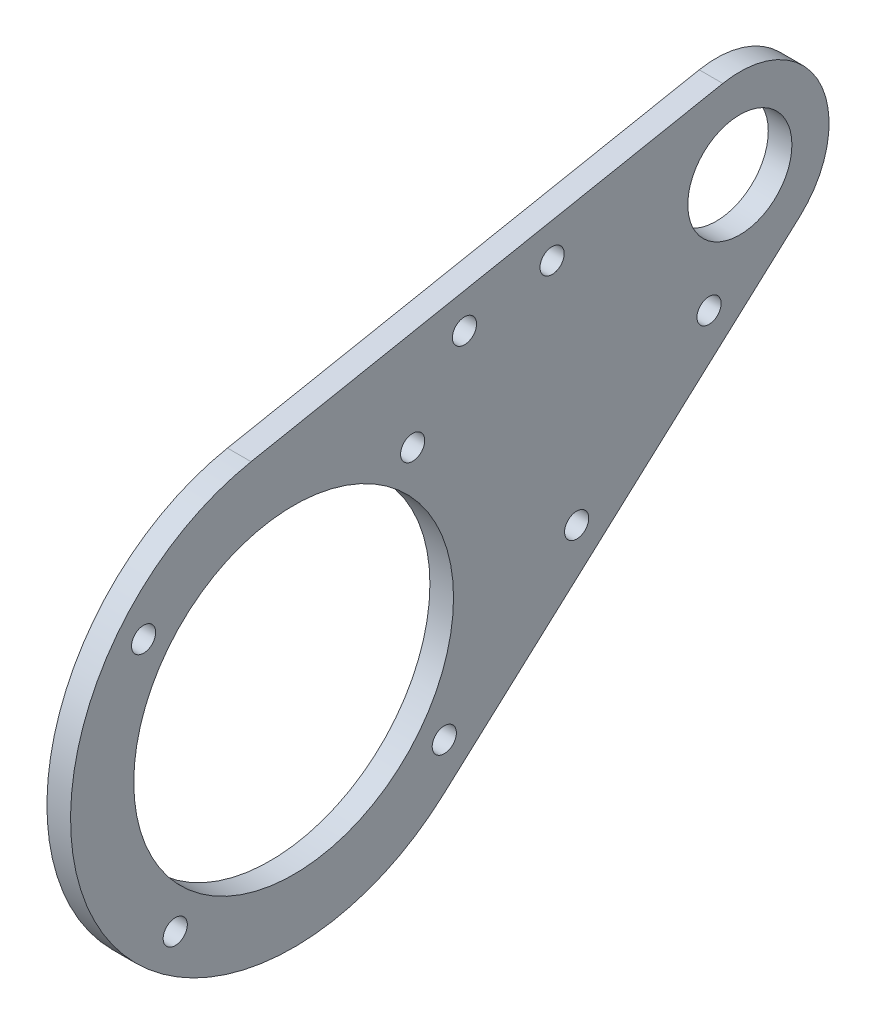
ISO-10303-21;
HEADER;
FILE_DESCRIPTION(('STEP AP214'),'2;1');
FILE_NAME('part.step','',(''),(''),'','','');
FILE_SCHEMA(('AUTOMOTIVE_DESIGN { 1 0 10303 214 1 1 1 1 }'));
ENDSEC;
DATA;
#1=APPLICATION_CONTEXT('core data for automotive mechanical design processes');
#2=APPLICATION_PROTOCOL_DEFINITION('international standard','automotive_design',2000,#1);
#3=PRODUCT_CONTEXT('',#1,'mechanical');
#4=PRODUCT('Part','Part','',(#3));
#5=PRODUCT_RELATED_PRODUCT_CATEGORY('part','',(#4));
#6=PRODUCT_DEFINITION_FORMATION('','',#4);
#7=PRODUCT_DEFINITION_CONTEXT('part definition',#1,'design');
#8=PRODUCT_DEFINITION('design','',#6,#7);
#9=PRODUCT_DEFINITION_SHAPE('','',#8);
#10=(LENGTH_UNIT() NAMED_UNIT(*) SI_UNIT(.MILLI.,.METRE.));
#11=(NAMED_UNIT(*) PLANE_ANGLE_UNIT() SI_UNIT($,.RADIAN.));
#12=(NAMED_UNIT(*) SI_UNIT($,.STERADIAN.) SOLID_ANGLE_UNIT());
#13=UNCERTAINTY_MEASURE_WITH_UNIT(LENGTH_MEASURE(1.E-05),#10,'distance_accuracy_value','');
#14=(GEOMETRIC_REPRESENTATION_CONTEXT(3) GLOBAL_UNCERTAINTY_ASSIGNED_CONTEXT((#13)) GLOBAL_UNIT_ASSIGNED_CONTEXT((#10,
#11,#12)) REPRESENTATION_CONTEXT('',''));
#15=CARTESIAN_POINT('',(0.,0.,0.));
#16=DIRECTION('',(0.,0.,1.));
#17=DIRECTION('',(1.,0.,0.));
#18=AXIS2_PLACEMENT_3D('',#15,#16,#17);
#19=CARTESIAN_POINT('',(3.175,0.,0.));
#20=DIRECTION('',(1.,0.,0.));
#21=DIRECTION('',(0.,0.,-1.));
#22=AXIS2_PLACEMENT_3D('',#19,#20,#21);
#23=PLANE('',#22);
#24=CARTESIAN_POINT('',(3.175,16.,20.1757899473602));
#25=DIRECTION('',(1.,0.,0.));
#26=DIRECTION('',(0.,0.,-1.));
#27=AXIS2_PLACEMENT_3D('',#24,#25,#26);
#28=CIRCLE('',#27,1.625);
#29=CARTESIAN_POINT('',(3.175,16.,18.5507899473602));
#30=VERTEX_POINT('',#29);
#31=EDGE_CURVE('E145',#30,#30,#28,.T.);
#32=ORIENTED_EDGE('',*,*,#31,.F.);
#33=EDGE_LOOP('',(#32));
#34=FACE_BOUND('',#33,.T.);
#35=CARTESIAN_POINT('',(3.175,30.3415774539269,-22.9747473053413));
#36=DIRECTION('',(1.,0.,0.));
#37=DIRECTION('',(0.,0.,1.));
#38=AXIS2_PLACEMENT_3D('',#35,#36,#37);
#39=CIRCLE('',#38,1.625);
#40=CARTESIAN_POINT('',(3.175,30.3415774539269,-21.3497473053413));
#41=VERTEX_POINT('',#40);
#42=EDGE_CURVE('E161',#41,#41,#39,.T.);
#43=ORIENTED_EDGE('',*,*,#42,.F.);
#44=EDGE_LOOP('',(#43));
#45=FACE_BOUND('',#44,.T.);
#46=CARTESIAN_POINT('',(3.175,32.631335668776,-34.7542637350396));
#47=DIRECTION('',(1.,0.,0.));
#48=DIRECTION('',(0.,0.,-1.));
#49=AXIS2_PLACEMENT_3D('',#46,#47,#48);
#50=CIRCLE('',#49,1.625);
#51=CARTESIAN_POINT('',(3.175,32.631335668776,-36.3792637350396));
#52=VERTEX_POINT('',#51);
#53=EDGE_CURVE('E167',#52,#52,#50,.T.);
#54=ORIENTED_EDGE('',*,*,#53,.F.);
#55=EDGE_LOOP('',(#54));
#56=FACE_BOUND('',#55,.T.);
#57=CARTESIAN_POINT('',(3.175,16.2743678016152,-55.8571432057428));
#58=DIRECTION('',(1.,0.,0.));
#59=DIRECTION('',(0.,0.,-1.));
#60=AXIS2_PLACEMENT_3D('',#57,#58,#59);
#61=CIRCLE('',#60,1.625);
#62=CARTESIAN_POINT('',(3.175,16.2743678016152,-57.4821432057428));
#63=VERTEX_POINT('',#62);
#64=EDGE_CURVE('E150',#63,#63,#61,.T.);
#65=ORIENTED_EDGE('',*,*,#64,.F.);
#66=EDGE_LOOP('',(#65));
#67=FACE_BOUND('',#66,.T.);
#68=CARTESIAN_POINT('',(3.175,20.2551011882643,-16.0039762986855));
#69=DIRECTION('',(1.,0.,0.));
#70=DIRECTION('',(0.,0.,-1.));
#71=AXIS2_PLACEMENT_3D('',#68,#69,#70);
#72=CIRCLE('',#71,1.625);
#73=CARTESIAN_POINT('',(3.175,20.2551011882643,-17.6289762986855));
#74=VERTEX_POINT('',#73);
#75=EDGE_CURVE('E142',#74,#74,#72,.T.);
#76=ORIENTED_EDGE('',*,*,#75,.F.);
#77=EDGE_LOOP('',(#76));
#78=FACE_BOUND('',#77,.T.);
#79=CARTESIAN_POINT('',(3.175,-15.9246650577813,-20.2590774869498));
#80=DIRECTION('',(1.,0.,0.));
#81=DIRECTION('',(0.,0.,-1.));
#82=AXIS2_PLACEMENT_3D('',#79,#80,#81);
#83=CIRCLE('',#82,1.62500000000001);
#84=CARTESIAN_POINT('',(3.175,-15.9246650577813,-21.8840774869498));
#85=VERTEX_POINT('',#84);
#86=EDGE_CURVE('E135',#85,#85,#83,.T.);
#87=ORIENTED_EDGE('',*,*,#86,.F.);
#88=EDGE_LOOP('',(#87));
#89=FACE_BOUND('',#88,.T.);
#90=CARTESIAN_POINT('',(3.175,-20.1797662460457,15.9206887590958));
#91=DIRECTION('',(1.,0.,0.));
#92=DIRECTION('',(0.,0.,-1.));
#93=AXIS2_PLACEMENT_3D('',#90,#91,#92);
#94=CIRCLE('',#93,1.625);
#95=CARTESIAN_POINT('',(3.175,-20.1797662460457,14.2956887590958));
#96=VERTEX_POINT('',#95);
#97=EDGE_CURVE('E136',#96,#96,#94,.T.);
#98=ORIENTED_EDGE('',*,*,#97,.F.);
#99=EDGE_LOOP('',(#98));
#100=FACE_BOUND('',#99,.T.);
#101=CARTESIAN_POINT('',(3.175,0.174851371916925,-38.0581103463463));
#102=DIRECTION('',(1.,0.,0.));
#103=DIRECTION('',(0.,0.,-1.));
#104=AXIS2_PLACEMENT_3D('',#101,#102,#103);
#105=CIRCLE('',#104,1.625);
#106=CARTESIAN_POINT('',(3.175,0.174851371916925,-39.6831103463463));
#107=VERTEX_POINT('',#106);
#108=EDGE_CURVE('E149',#107,#107,#105,.T.);
#109=ORIENTED_EDGE('',*,*,#108,.F.);
#110=EDGE_LOOP('',(#109));
#111=FACE_BOUND('',#110,.T.);
#112=CARTESIAN_POINT('',(3.175,0.,0.));
#113=DIRECTION('',(1.,0.,0.));
#114=DIRECTION('',(0.,0.,-1.));
#115=AXIS2_PLACEMENT_3D('',#112,#113,#114);
#116=CIRCLE('',#115,21.5);
#117=CARTESIAN_POINT('',(3.175,0.,-21.5));
#118=VERTEX_POINT('',#117);
#119=EDGE_CURVE('E108',#118,#118,#116,.T.);
#120=ORIENTED_EDGE('',*,*,#119,.F.);
#121=EDGE_LOOP('',(#120));
#122=FACE_BOUND('',#121,.T.);
#123=CARTESIAN_POINT('',(3.175,0.,0.));
#124=DIRECTION('',(1.,0.,0.));
#125=DIRECTION('',(0.,0.,-1.));
#126=AXIS2_PLACEMENT_3D('',#123,#124,#125);
#127=CIRCLE('',#126,30.);
#128=CARTESIAN_POINT('',(3.175,29.4487910742456,5.72439553712281));
#129=VERTEX_POINT('',#128);
#130=CARTESIAN_POINT('',(3.175,-22.2487910742456,-20.1243955371228));
#131=VERTEX_POINT('',#130);
#132=EDGE_CURVE('E93',#129,#131,#127,.T.);
#133=ORIENTED_EDGE('',*,*,#132,.T.);
#134=DIRECTION('',(0.,0.67081318457076,-0.741626369141521));
#135=VECTOR('',#134,1.);
#136=CARTESIAN_POINT('',(3.175,-22.2487910742456,-20.1243955371228));
#137=LINE('',#136,#135);
#138=CARTESIAN_POINT('',(3.175,21.1004835703017,-68.0497582148491));
#139=VERTEX_POINT('',#138);
#140=EDGE_CURVE('E88',#131,#139,#137,.T.);
#141=ORIENTED_EDGE('',*,*,#140,.T.);
#142=CARTESIAN_POINT('',(3.175,30.,-60.));
#143=DIRECTION('',(1.,0.,0.));
#144=DIRECTION('',(0.,0.,-1.));
#145=AXIS2_PLACEMENT_3D('',#142,#143,#144);
#146=CIRCLE('',#145,12.);
#147=CARTESIAN_POINT('',(3.175,41.7795164296983,-57.7102417851509));
#148=VERTEX_POINT('',#147);
#149=EDGE_CURVE('E91',#139,#148,#146,.T.);
#150=ORIENTED_EDGE('',*,*,#149,.T.);
#151=DIRECTION('',(0.,-0.190813184570761,0.981626369141521));
#152=VECTOR('',#151,1.);
#153=CARTESIAN_POINT('',(3.175,29.4487910742456,5.72439553712281));
#154=LINE('',#153,#152);
#155=EDGE_CURVE('E58',#148,#129,#154,.T.);
#156=ORIENTED_EDGE('',*,*,#155,.T.);
#157=EDGE_LOOP('',(#133,#141,#150,#156));
#158=FACE_BOUND('',#157,.T.);
#159=CARTESIAN_POINT('',(3.175,30.,-60.));
#160=DIRECTION('',(1.,0.,0.));
#161=DIRECTION('',(0.,0.,-1.));
#162=AXIS2_PLACEMENT_3D('',#159,#160,#161);
#163=CIRCLE('',#162,7.);
#164=CARTESIAN_POINT('',(3.175,30.,-67.));
#165=VERTEX_POINT('',#164);
#166=EDGE_CURVE('E123',#165,#165,#163,.T.);
#167=ORIENTED_EDGE('',*,*,#166,.F.);
#168=EDGE_LOOP('',(#167));
#169=FACE_BOUND('',#168,.T.);
#170=ADVANCED_FACE('F41',(#34,#45,#56,#67,#78,#89,#100,#111,#122,#158,#169),#23,.T.);
#171=CARTESIAN_POINT('',(0.,0.,0.));
#172=DIRECTION('',(1.,0.,0.));
#173=DIRECTION('',(0.,0.,-1.));
#174=AXIS2_PLACEMENT_3D('',#171,#172,#173);
#175=PLANE('',#174);
#176=CARTESIAN_POINT('',(0.,16.,20.1757899473602));
#177=DIRECTION('',(1.,0.,0.));
#178=DIRECTION('',(0.,0.,-1.));
#179=AXIS2_PLACEMENT_3D('',#176,#177,#178);
#180=CIRCLE('',#179,1.625);
#181=CARTESIAN_POINT('',(0.,16.,18.5507899473602));
#182=VERTEX_POINT('',#181);
#183=EDGE_CURVE('E129',#182,#182,#180,.T.);
#184=ORIENTED_EDGE('',*,*,#183,.T.);
#185=EDGE_LOOP('',(#184));
#186=FACE_BOUND('',#185,.T.);
#187=CARTESIAN_POINT('',(0.,30.3415774539269,-22.9747473053413));
#188=DIRECTION('',(1.,0.,0.));
#189=DIRECTION('',(0.,0.,1.));
#190=AXIS2_PLACEMENT_3D('',#187,#188,#189);
#191=CIRCLE('',#190,1.625);
#192=CARTESIAN_POINT('',(0.,30.3415774539269,-21.3497473053413));
#193=VERTEX_POINT('',#192);
#194=EDGE_CURVE('E158',#193,#193,#191,.T.);
#195=ORIENTED_EDGE('',*,*,#194,.T.);
#196=EDGE_LOOP('',(#195));
#197=FACE_BOUND('',#196,.T.);
#198=CARTESIAN_POINT('',(0.,32.631335668776,-34.7542637350396));
#199=DIRECTION('',(1.,0.,0.));
#200=DIRECTION('',(0.,0.,-1.));
#201=AXIS2_PLACEMENT_3D('',#198,#199,#200);
#202=CIRCLE('',#201,1.625);
#203=CARTESIAN_POINT('',(0.,32.631335668776,-36.3792637350396));
#204=VERTEX_POINT('',#203);
#205=EDGE_CURVE('E164',#204,#204,#202,.T.);
#206=ORIENTED_EDGE('',*,*,#205,.T.);
#207=EDGE_LOOP('',(#206));
#208=FACE_BOUND('',#207,.T.);
#209=CARTESIAN_POINT('',(0.,16.2743678016152,-55.8571432057428));
#210=DIRECTION('',(1.,0.,0.));
#211=DIRECTION('',(0.,0.,-1.));
#212=AXIS2_PLACEMENT_3D('',#209,#210,#211);
#213=CIRCLE('',#212,1.625);
#214=CARTESIAN_POINT('',(0.,16.2743678016152,-57.4821432057428));
#215=VERTEX_POINT('',#214);
#216=EDGE_CURVE('E170',#215,#215,#213,.T.);
#217=ORIENTED_EDGE('',*,*,#216,.T.);
#218=EDGE_LOOP('',(#217));
#219=FACE_BOUND('',#218,.T.);
#220=CARTESIAN_POINT('',(0.,20.2551011882643,-16.0039762986855));
#221=DIRECTION('',(1.,0.,0.));
#222=DIRECTION('',(0.,0.,-1.));
#223=AXIS2_PLACEMENT_3D('',#220,#221,#222);
#224=CIRCLE('',#223,1.625);
#225=CARTESIAN_POINT('',(0.,20.2551011882643,-17.6289762986855));
#226=VERTEX_POINT('',#225);
#227=EDGE_CURVE('E139',#226,#226,#224,.T.);
#228=ORIENTED_EDGE('',*,*,#227,.T.);
#229=EDGE_LOOP('',(#228));
#230=FACE_BOUND('',#229,.T.);
#231=CARTESIAN_POINT('',(0.,-15.9246650577813,-20.2590774869498));
#232=DIRECTION('',(1.,0.,0.));
#233=DIRECTION('',(0.,0.,-1.));
#234=AXIS2_PLACEMENT_3D('',#231,#232,#233);
#235=CIRCLE('',#234,1.62500000000001);
#236=CARTESIAN_POINT('',(0.,-15.9246650577813,-21.8840774869498));
#237=VERTEX_POINT('',#236);
#238=EDGE_CURVE('E132',#237,#237,#235,.T.);
#239=ORIENTED_EDGE('',*,*,#238,.T.);
#240=EDGE_LOOP('',(#239));
#241=FACE_BOUND('',#240,.T.);
#242=CARTESIAN_POINT('',(0.,-20.1797662460457,15.9206887590958));
#243=DIRECTION('',(1.,0.,0.));
#244=DIRECTION('',(0.,0.,-1.));
#245=AXIS2_PLACEMENT_3D('',#242,#243,#244);
#246=CIRCLE('',#245,1.625);
#247=CARTESIAN_POINT('',(0.,-20.1797662460457,14.2956887590958));
#248=VERTEX_POINT('',#247);
#249=EDGE_CURVE('E153',#248,#248,#246,.T.);
#250=ORIENTED_EDGE('',*,*,#249,.T.);
#251=EDGE_LOOP('',(#250));
#252=FACE_BOUND('',#251,.T.);
#253=CARTESIAN_POINT('',(0.,0.174851371916925,-38.0581103463463));
#254=DIRECTION('',(1.,0.,0.));
#255=DIRECTION('',(0.,0.,-1.));
#256=AXIS2_PLACEMENT_3D('',#253,#254,#255);
#257=CIRCLE('',#256,1.625);
#258=CARTESIAN_POINT('',(0.,0.174851371916925,-39.6831103463463));
#259=VERTEX_POINT('',#258);
#260=EDGE_CURVE('E146',#259,#259,#257,.T.);
#261=ORIENTED_EDGE('',*,*,#260,.T.);
#262=EDGE_LOOP('',(#261));
#263=FACE_BOUND('',#262,.T.);
#264=CARTESIAN_POINT('',(0.,0.,0.));
#265=DIRECTION('',(1.,0.,0.));
#266=DIRECTION('',(0.,0.,-1.));
#267=AXIS2_PLACEMENT_3D('',#264,#265,#266);
#268=CIRCLE('',#267,30.);
#269=CARTESIAN_POINT('',(0.,29.4487910742456,5.72439553712281));
#270=VERTEX_POINT('',#269);
#271=CARTESIAN_POINT('',(0.,-22.2487910742456,-20.1243955371228));
#272=VERTEX_POINT('',#271);
#273=EDGE_CURVE('E105',#270,#272,#268,.T.);
#274=ORIENTED_EDGE('',*,*,#273,.F.);
#275=DIRECTION('',(0.,-0.190813184570761,0.981626369141521));
#276=VECTOR('',#275,1.);
#277=CARTESIAN_POINT('',(0.,29.4487910742456,5.72439553712281));
#278=LINE('',#277,#276);
#279=CARTESIAN_POINT('',(0.,41.7795164296983,-57.7102417851509));
#280=VERTEX_POINT('',#279);
#281=EDGE_CURVE('E81',#280,#270,#278,.T.);
#282=ORIENTED_EDGE('',*,*,#281,.F.);
#283=CARTESIAN_POINT('',(0.,30.,-60.));
#284=DIRECTION('',(1.,0.,0.));
#285=DIRECTION('',(0.,0.,-1.));
#286=AXIS2_PLACEMENT_3D('',#283,#284,#285);
#287=CIRCLE('',#286,12.);
#288=CARTESIAN_POINT('',(0.,21.1004835703017,-68.0497582148491));
#289=VERTEX_POINT('',#288);
#290=EDGE_CURVE('E75',#289,#280,#287,.T.);
#291=ORIENTED_EDGE('',*,*,#290,.F.);
#292=DIRECTION('',(0.,0.67081318457076,-0.741626369141521));
#293=VECTOR('',#292,1.);
#294=CARTESIAN_POINT('',(0.,-22.2487910742456,-20.1243955371228));
#295=LINE('',#294,#293);
#296=EDGE_CURVE('E97',#272,#289,#295,.T.);
#297=ORIENTED_EDGE('',*,*,#296,.F.);
#298=EDGE_LOOP('',(#274,#282,#291,#297));
#299=FACE_BOUND('',#298,.T.);
#300=CARTESIAN_POINT('',(0.,0.,0.));
#301=DIRECTION('',(1.,0.,0.));
#302=DIRECTION('',(0.,0.,-1.));
#303=AXIS2_PLACEMENT_3D('',#300,#301,#302);
#304=CIRCLE('',#303,21.5);
#305=CARTESIAN_POINT('',(0.,0.,-21.5));
#306=VERTEX_POINT('',#305);
#307=EDGE_CURVE('E120',#306,#306,#304,.T.);
#308=ORIENTED_EDGE('',*,*,#307,.T.);
#309=EDGE_LOOP('',(#308));
#310=FACE_BOUND('',#309,.T.);
#311=CARTESIAN_POINT('',(0.,30.,-60.));
#312=DIRECTION('',(1.,0.,0.));
#313=DIRECTION('',(0.,0.,-1.));
#314=AXIS2_PLACEMENT_3D('',#311,#312,#313);
#315=CIRCLE('',#314,7.);
#316=CARTESIAN_POINT('',(0.,30.,-67.));
#317=VERTEX_POINT('',#316);
#318=EDGE_CURVE('E126',#317,#317,#315,.T.);
#319=ORIENTED_EDGE('',*,*,#318,.T.);
#320=EDGE_LOOP('',(#319));
#321=FACE_BOUND('',#320,.T.);
#322=ADVANCED_FACE('F116',(#186,#197,#208,#219,#230,#241,#252,#263,#299,#310,#321),#175,.F.);
#323=CARTESIAN_POINT('',(3.175,0.,0.));
#324=DIRECTION('',(-1.,0.,0.));
#325=DIRECTION('',(0.,0.,1.));
#326=AXIS2_PLACEMENT_3D('',#323,#324,#325);
#327=CYLINDRICAL_SURFACE('',#326,30.);
#328=ORIENTED_EDGE('',*,*,#273,.T.);
#329=DIRECTION('',(-1.,0.,0.));
#330=VECTOR('',#329,1.);
#331=CARTESIAN_POINT('',(3.175,-22.2487910742456,-20.1243955371228));
#332=LINE('',#331,#330);
#333=EDGE_CURVE('E11',#131,#272,#332,.T.);
#334=ORIENTED_EDGE('',*,*,#333,.F.);
#335=ORIENTED_EDGE('',*,*,#132,.F.);
#336=DIRECTION('',(-1.,0.,0.));
#337=VECTOR('',#336,1.);
#338=CARTESIAN_POINT('',(3.175,29.4487910742456,5.72439553712281));
#339=LINE('',#338,#337);
#340=EDGE_CURVE('E101',#129,#270,#339,.T.);
#341=ORIENTED_EDGE('',*,*,#340,.T.);
#342=EDGE_LOOP('',(#328,#334,#335,#341));
#343=FACE_BOUND('',#342,.T.);
#344=ADVANCED_FACE('F43',(#343),#327,.T.);
#345=CARTESIAN_POINT('',(3.175,-22.2487910742456,-20.1243955371228));
#346=DIRECTION('',(0.,0.741626369141521,0.67081318457076));
#347=DIRECTION('',(0.,-0.67081318457076,0.741626369141521));
#348=AXIS2_PLACEMENT_3D('',#345,#346,#347);
#349=PLANE('',#348);
#350=ORIENTED_EDGE('',*,*,#296,.T.);
#351=DIRECTION('',(-1.,0.,0.));
#352=VECTOR('',#351,1.);
#353=CARTESIAN_POINT('',(3.175,21.1004835703017,-68.0497582148491));
#354=LINE('',#353,#352);
#355=EDGE_CURVE('E50',#139,#289,#354,.T.);
#356=ORIENTED_EDGE('',*,*,#355,.F.);
#357=ORIENTED_EDGE('',*,*,#140,.F.);
#358=ORIENTED_EDGE('',*,*,#333,.T.);
#359=EDGE_LOOP('',(#350,#356,#357,#358));
#360=FACE_BOUND('',#359,.T.);
#361=ADVANCED_FACE('F96',(#360),#349,.F.);
#362=CARTESIAN_POINT('',(3.175,30.,-60.));
#363=DIRECTION('',(-1.,0.,0.));
#364=DIRECTION('',(0.,0.,1.));
#365=AXIS2_PLACEMENT_3D('',#362,#363,#364);
#366=CYLINDRICAL_SURFACE('',#365,12.);
#367=ORIENTED_EDGE('',*,*,#290,.T.);
#368=DIRECTION('',(-1.,0.,0.));
#369=VECTOR('',#368,1.);
#370=CARTESIAN_POINT('',(3.175,41.7795164296983,-57.7102417851509));
#371=LINE('',#370,#369);
#372=EDGE_CURVE('E98',#148,#280,#371,.T.);
#373=ORIENTED_EDGE('',*,*,#372,.F.);
#374=ORIENTED_EDGE('',*,*,#149,.F.);
#375=ORIENTED_EDGE('',*,*,#355,.T.);
#376=EDGE_LOOP('',(#367,#373,#374,#375));
#377=FACE_BOUND('',#376,.T.);
#378=ADVANCED_FACE('F99',(#377),#366,.T.);
#379=CARTESIAN_POINT('',(3.175,29.4487910742456,5.72439553712281));
#380=DIRECTION('',(0.,-0.981626369141521,-0.190813184570761));
#381=DIRECTION('',(0.,0.190813184570761,-0.981626369141521));
#382=AXIS2_PLACEMENT_3D('',#379,#380,#381);
#383=PLANE('',#382);
#384=ORIENTED_EDGE('',*,*,#281,.T.);
#385=ORIENTED_EDGE('',*,*,#340,.F.);
#386=ORIENTED_EDGE('',*,*,#155,.F.);
#387=ORIENTED_EDGE('',*,*,#372,.T.);
#388=EDGE_LOOP('',(#384,#385,#386,#387));
#389=FACE_BOUND('',#388,.T.);
#390=ADVANCED_FACE('F113',(#389),#383,.F.);
#391=CARTESIAN_POINT('',(3.175,0.,0.));
#392=DIRECTION('',(-1.,0.,0.));
#393=DIRECTION('',(0.,0.,1.));
#394=AXIS2_PLACEMENT_3D('',#391,#392,#393);
#395=CYLINDRICAL_SURFACE('',#394,21.5);
#396=ORIENTED_EDGE('',*,*,#119,.T.);
#397=EDGE_LOOP('',(#396));
#398=FACE_BOUND('',#397,.T.);
#399=ORIENTED_EDGE('',*,*,#307,.F.);
#400=EDGE_LOOP('',(#399));
#401=FACE_BOUND('',#400,.T.);
#402=ADVANCED_FACE('F208',(#398,#401),#395,.F.);
#403=CARTESIAN_POINT('',(3.175,30.,-60.));
#404=DIRECTION('',(-1.,0.,0.));
#405=DIRECTION('',(0.,0.,1.));
#406=AXIS2_PLACEMENT_3D('',#403,#404,#405);
#407=CYLINDRICAL_SURFACE('',#406,7.);
#408=ORIENTED_EDGE('',*,*,#166,.T.);
#409=EDGE_LOOP('',(#408));
#410=FACE_BOUND('',#409,.T.);
#411=ORIENTED_EDGE('',*,*,#318,.F.);
#412=EDGE_LOOP('',(#411));
#413=FACE_BOUND('',#412,.T.);
#414=ADVANCED_FACE('F211',(#410,#413),#407,.F.);
#415=CARTESIAN_POINT('',(0.,0.174851371916925,-38.0581103463463));
#416=DIRECTION('',(1.,0.,0.));
#417=DIRECTION('',(0.,0.,-1.));
#418=AXIS2_PLACEMENT_3D('',#415,#416,#417);
#419=CYLINDRICAL_SURFACE('',#418,1.625);
#420=ORIENTED_EDGE('',*,*,#260,.F.);
#421=EDGE_LOOP('',(#420));
#422=FACE_BOUND('',#421,.T.);
#423=ORIENTED_EDGE('',*,*,#108,.T.);
#424=EDGE_LOOP('',(#423));
#425=FACE_BOUND('',#424,.T.);
#426=ADVANCED_FACE('F220',(#422,#425),#419,.F.);
#427=CARTESIAN_POINT('',(0.,-20.1797662460457,15.9206887590958));
#428=DIRECTION('',(1.,0.,0.));
#429=DIRECTION('',(0.,0.,-1.));
#430=AXIS2_PLACEMENT_3D('',#427,#428,#429);
#431=CYLINDRICAL_SURFACE('',#430,1.625);
#432=ORIENTED_EDGE('',*,*,#249,.F.);
#433=EDGE_LOOP('',(#432));
#434=FACE_BOUND('',#433,.T.);
#435=ORIENTED_EDGE('',*,*,#97,.T.);
#436=EDGE_LOOP('',(#435));
#437=FACE_BOUND('',#436,.T.);
#438=ADVANCED_FACE('F226',(#434,#437),#431,.F.);
#439=CARTESIAN_POINT('',(0.,-15.9246650577813,-20.2590774869498));
#440=DIRECTION('',(1.,0.,0.));
#441=DIRECTION('',(0.,0.,-1.));
#442=AXIS2_PLACEMENT_3D('',#439,#440,#441);
#443=CYLINDRICAL_SURFACE('',#442,1.62500000000001);
#444=ORIENTED_EDGE('',*,*,#238,.F.);
#445=EDGE_LOOP('',(#444));
#446=FACE_BOUND('',#445,.T.);
#447=ORIENTED_EDGE('',*,*,#86,.T.);
#448=EDGE_LOOP('',(#447));
#449=FACE_BOUND('',#448,.T.);
#450=ADVANCED_FACE('F230',(#446,#449),#443,.F.);
#451=CARTESIAN_POINT('',(0.,20.2551011882643,-16.0039762986855));
#452=DIRECTION('',(1.,0.,0.));
#453=DIRECTION('',(0.,0.,-1.));
#454=AXIS2_PLACEMENT_3D('',#451,#452,#453);
#455=CYLINDRICAL_SURFACE('',#454,1.625);
#456=ORIENTED_EDGE('',*,*,#227,.F.);
#457=EDGE_LOOP('',(#456));
#458=FACE_BOUND('',#457,.T.);
#459=ORIENTED_EDGE('',*,*,#75,.T.);
#460=EDGE_LOOP('',(#459));
#461=FACE_BOUND('',#460,.T.);
#462=ADVANCED_FACE('F298',(#458,#461),#455,.F.);
#463=CARTESIAN_POINT('',(0.,16.2743678016152,-55.8571432057428));
#464=DIRECTION('',(1.,0.,0.));
#465=DIRECTION('',(0.,0.,-1.));
#466=AXIS2_PLACEMENT_3D('',#463,#464,#465);
#467=CYLINDRICAL_SURFACE('',#466,1.625);
#468=ORIENTED_EDGE('',*,*,#216,.F.);
#469=EDGE_LOOP('',(#468));
#470=FACE_BOUND('',#469,.T.);
#471=ORIENTED_EDGE('',*,*,#64,.T.);
#472=EDGE_LOOP('',(#471));
#473=FACE_BOUND('',#472,.T.);
#474=ADVANCED_FACE('F307',(#470,#473),#467,.F.);
#475=CARTESIAN_POINT('',(0.,32.631335668776,-34.7542637350396));
#476=DIRECTION('',(1.,0.,0.));
#477=DIRECTION('',(0.,0.,-1.));
#478=AXIS2_PLACEMENT_3D('',#475,#476,#477);
#479=CYLINDRICAL_SURFACE('',#478,1.625);
#480=ORIENTED_EDGE('',*,*,#205,.F.);
#481=EDGE_LOOP('',(#480));
#482=FACE_BOUND('',#481,.T.);
#483=ORIENTED_EDGE('',*,*,#53,.T.);
#484=EDGE_LOOP('',(#483));
#485=FACE_BOUND('',#484,.T.);
#486=ADVANCED_FACE('F316',(#482,#485),#479,.F.);
#487=CARTESIAN_POINT('',(0.,30.3415774539269,-22.9747473053413));
#488=DIRECTION('',(1.,0.,0.));
#489=DIRECTION('',(0.,0.,-1.));
#490=AXIS2_PLACEMENT_3D('',#487,#488,#489);
#491=CYLINDRICAL_SURFACE('',#490,1.625);
#492=ORIENTED_EDGE('',*,*,#194,.F.);
#493=EDGE_LOOP('',(#492));
#494=FACE_BOUND('',#493,.T.);
#495=ORIENTED_EDGE('',*,*,#42,.T.);
#496=EDGE_LOOP('',(#495));
#497=FACE_BOUND('',#496,.T.);
#498=ADVANCED_FACE('F185',(#494,#497),#491,.F.);
#499=CARTESIAN_POINT('',(0.,16.,20.1757899473602));
#500=DIRECTION('',(1.,0.,0.));
#501=DIRECTION('',(0.,0.,-1.));
#502=AXIS2_PLACEMENT_3D('',#499,#500,#501);
#503=CYLINDRICAL_SURFACE('',#502,1.625);
#504=ORIENTED_EDGE('',*,*,#183,.F.);
#505=EDGE_LOOP('',(#504));
#506=FACE_BOUND('',#505,.T.);
#507=ORIENTED_EDGE('',*,*,#31,.T.);
#508=EDGE_LOOP('',(#507));
#509=FACE_BOUND('',#508,.T.);
#510=ADVANCED_FACE('F182',(#506,#509),#503,.F.);
#511=CLOSED_SHELL('',(#170,#322,#344,#361,#378,#390,#402,#414,#426,#438,#450,#462,#474,#486,
#498,#510));
#512=MANIFOLD_SOLID_BREP('B2',#511);
#513=ADVANCED_BREP_SHAPE_REPRESENTATION('',(#18,#512),#14);
#514=SHAPE_DEFINITION_REPRESENTATION(#9,#513);
ENDSEC;
END-ISO-10303-21;
